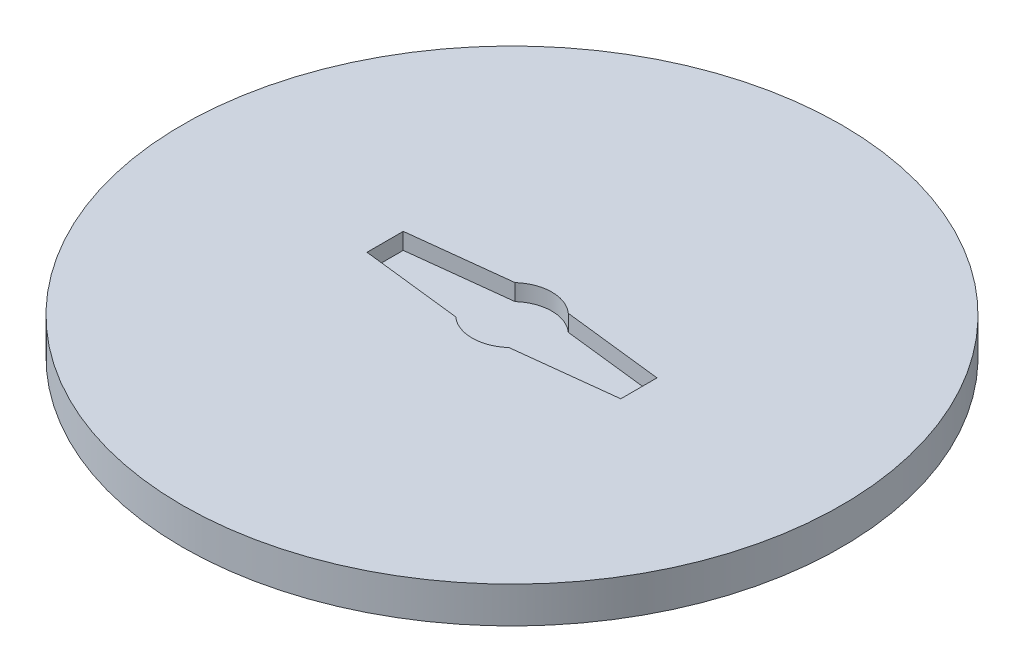
ISO-10303-21;
HEADER;
FILE_DESCRIPTION(('STEP AP214'),'2;1');
FILE_NAME('part.step','',(''),(''),'','','');
FILE_SCHEMA(('AUTOMOTIVE_DESIGN { 1 0 10303 214 1 1 1 1 }'));
ENDSEC;
DATA;
#1=APPLICATION_CONTEXT('core data for automotive mechanical design processes');
#2=APPLICATION_PROTOCOL_DEFINITION('international standard','automotive_design',2000,#1);
#3=PRODUCT_CONTEXT('',#1,'mechanical');
#4=PRODUCT('Part','Part','',(#3));
#5=PRODUCT_RELATED_PRODUCT_CATEGORY('part','',(#4));
#6=PRODUCT_DEFINITION_FORMATION('','',#4);
#7=PRODUCT_DEFINITION_CONTEXT('part definition',#1,'design');
#8=PRODUCT_DEFINITION('design','',#6,#7);
#9=PRODUCT_DEFINITION_SHAPE('','',#8);
#10=(LENGTH_UNIT() NAMED_UNIT(*) SI_UNIT(.MILLI.,.METRE.));
#11=(NAMED_UNIT(*) PLANE_ANGLE_UNIT() SI_UNIT($,.RADIAN.));
#12=(NAMED_UNIT(*) SI_UNIT($,.STERADIAN.) SOLID_ANGLE_UNIT());
#13=UNCERTAINTY_MEASURE_WITH_UNIT(LENGTH_MEASURE(1.E-05),#10,'distance_accuracy_value','');
#14=(GEOMETRIC_REPRESENTATION_CONTEXT(3) GLOBAL_UNCERTAINTY_ASSIGNED_CONTEXT((#13)) GLOBAL_UNIT_ASSIGNED_CONTEXT((#10,
#11,#12)) REPRESENTATION_CONTEXT('',''));
#15=CARTESIAN_POINT('',(0.,0.,0.));
#16=DIRECTION('',(0.,0.,1.));
#17=DIRECTION('',(1.,0.,0.));
#18=AXIS2_PLACEMENT_3D('',#15,#16,#17);
#19=CARTESIAN_POINT('',(0.,5.5,0.));
#20=DIRECTION('',(0.,-1.,0.));
#21=DIRECTION('',(0.,0.,-1.));
#22=AXIS2_PLACEMENT_3D('',#19,#20,#21);
#23=CYLINDRICAL_SURFACE('',#22,50.);
#24=CARTESIAN_POINT('',(0.,5.5,0.));
#25=DIRECTION('',(0.,1.,0.));
#26=DIRECTION('',(0.,0.,1.));
#27=AXIS2_PLACEMENT_3D('',#24,#25,#26);
#28=CIRCLE('',#27,50.);
#29=CARTESIAN_POINT('',(0.,5.5,50.));
#30=VERTEX_POINT('',#29);
#31=EDGE_CURVE('E11',#30,#30,#28,.T.);
#32=ORIENTED_EDGE('',*,*,#31,.F.);
#33=EDGE_LOOP('',(#32));
#34=FACE_BOUND('',#33,.T.);
#35=CARTESIAN_POINT('',(0.,0.,0.));
#36=DIRECTION('',(0.,1.,0.));
#37=DIRECTION('',(0.,0.,1.));
#38=AXIS2_PLACEMENT_3D('',#35,#36,#37);
#39=CIRCLE('',#38,50.);
#40=CARTESIAN_POINT('',(0.,0.,50.));
#41=VERTEX_POINT('',#40);
#42=EDGE_CURVE('E42',#41,#41,#39,.T.);
#43=ORIENTED_EDGE('',*,*,#42,.T.);
#44=EDGE_LOOP('',(#43));
#45=FACE_BOUND('',#44,.T.);
#46=ADVANCED_FACE('F39',(#34,#45),#23,.T.);
#47=CARTESIAN_POINT('',(0.,5.5,0.));
#48=DIRECTION('',(0.,1.,0.));
#49=DIRECTION('',(0.,0.,1.));
#50=AXIS2_PLACEMENT_3D('',#47,#48,#49);
#51=PLANE('',#50);
#52=CARTESIAN_POINT('',(0.,5.5,0.));
#53=DIRECTION('',(0.,1.,0.));
#54=DIRECTION('',(0.,0.,1.));
#55=AXIS2_PLACEMENT_3D('',#52,#53,#54);
#56=CIRCLE('',#55,6.05);
#57=CARTESIAN_POINT('',(4.04382244911915,5.5,-4.5));
#58=VERTEX_POINT('',#57);
#59=CARTESIAN_POINT('',(-4.04382244911915,5.5,-4.5));
#60=VERTEX_POINT('',#59);
#61=EDGE_CURVE('E53',#58,#60,#56,.T.);
#62=ORIENTED_EDGE('',*,*,#61,.F.);
#63=DIRECTION('',(-0.993442807362027,0.,-0.114330173185623));
#64=VECTOR('',#63,1.);
#65=CARTESIAN_POINT('',(19.25,5.5,-2.75));
#66=LINE('',#65,#64);
#67=CARTESIAN_POINT('',(19.25,5.5,-2.75));
#68=VERTEX_POINT('',#67);
#69=EDGE_CURVE('E154',#68,#58,#66,.T.);
#70=ORIENTED_EDGE('',*,*,#69,.F.);
#71=DIRECTION('',(0.,0.,-1.));
#72=VECTOR('',#71,1.);
#73=CARTESIAN_POINT('',(19.25,5.5,-2.75));
#74=LINE('',#73,#72);
#75=CARTESIAN_POINT('',(19.25,5.5,2.75));
#76=VERTEX_POINT('',#75);
#77=EDGE_CURVE('E152',#76,#68,#74,.T.);
#78=ORIENTED_EDGE('',*,*,#77,.F.);
#79=DIRECTION('',(0.993442807362027,0.,-0.114330173185623));
#80=VECTOR('',#79,1.);
#81=CARTESIAN_POINT('',(19.25,5.5,2.75));
#82=LINE('',#81,#80);
#83=CARTESIAN_POINT('',(4.04382244911915,5.5,4.5));
#84=VERTEX_POINT('',#83);
#85=EDGE_CURVE('E113',#84,#76,#82,.T.);
#86=ORIENTED_EDGE('',*,*,#85,.F.);
#87=CARTESIAN_POINT('',(0.,5.5,0.));
#88=DIRECTION('',(0.,1.,0.));
#89=DIRECTION('',(0.,0.,1.));
#90=AXIS2_PLACEMENT_3D('',#87,#88,#89);
#91=CIRCLE('',#90,6.05);
#92=CARTESIAN_POINT('',(-4.04382244911915,5.5,4.5));
#93=VERTEX_POINT('',#92);
#94=EDGE_CURVE('E148',#93,#84,#91,.T.);
#95=ORIENTED_EDGE('',*,*,#94,.F.);
#96=DIRECTION('',(0.993442807362027,0.,0.114330173185623));
#97=VECTOR('',#96,1.);
#98=CARTESIAN_POINT('',(-4.04382244911915,5.5,4.5));
#99=LINE('',#98,#97);
#100=CARTESIAN_POINT('',(-19.25,5.5,2.75));
#101=VERTEX_POINT('',#100);
#102=EDGE_CURVE('E145',#101,#93,#99,.T.);
#103=ORIENTED_EDGE('',*,*,#102,.F.);
#104=DIRECTION('',(0.,0.,1.));
#105=VECTOR('',#104,1.);
#106=CARTESIAN_POINT('',(-19.25,5.5,2.75));
#107=LINE('',#106,#105);
#108=CARTESIAN_POINT('',(-19.25,5.5,-2.75));
#109=VERTEX_POINT('',#108);
#110=EDGE_CURVE('E142',#109,#101,#107,.T.);
#111=ORIENTED_EDGE('',*,*,#110,.F.);
#112=DIRECTION('',(-0.993442807362027,0.,0.114330173185624));
#113=VECTOR('',#112,1.);
#114=CARTESIAN_POINT('',(-4.04382244911915,5.5,-4.5));
#115=LINE('',#114,#113);
#116=EDGE_CURVE('E139',#60,#109,#115,.T.);
#117=ORIENTED_EDGE('',*,*,#116,.F.);
#118=EDGE_LOOP('',(#62,#70,#78,#86,#95,#103,#111,#117));
#119=FACE_BOUND('',#118,.T.);
#120=ORIENTED_EDGE('',*,*,#31,.T.);
#121=EDGE_LOOP('',(#120));
#122=FACE_BOUND('',#121,.T.);
#123=ADVANCED_FACE('F173',(#119,#122),#51,.T.);
#124=CARTESIAN_POINT('',(0.,0.,0.));
#125=DIRECTION('',(0.,1.,0.));
#126=DIRECTION('',(0.,0.,1.));
#127=AXIS2_PLACEMENT_3D('',#124,#125,#126);
#128=PLANE('',#127);
#129=ORIENTED_EDGE('',*,*,#42,.F.);
#130=EDGE_LOOP('',(#129));
#131=FACE_BOUND('',#130,.T.);
#132=ADVANCED_FACE('F200',(#131),#128,.F.);
#133=CARTESIAN_POINT('',(0.,3.,0.));
#134=DIRECTION('',(0.,1.,0.));
#135=DIRECTION('',(0.,0.,1.));
#136=AXIS2_PLACEMENT_3D('',#133,#134,#135);
#137=CYLINDRICAL_SURFACE('',#136,6.05);
#138=ORIENTED_EDGE('',*,*,#61,.T.);
#139=DIRECTION('',(0.,1.,0.));
#140=VECTOR('',#139,1.);
#141=CARTESIAN_POINT('',(-4.04382244911915,3.,-4.5));
#142=LINE('',#141,#140);
#143=CARTESIAN_POINT('',(-4.04382244911915,3.,-4.5));
#144=VERTEX_POINT('',#143);
#145=EDGE_CURVE('E89',#144,#60,#142,.T.);
#146=ORIENTED_EDGE('',*,*,#145,.F.);
#147=CARTESIAN_POINT('',(0.,3.,0.));
#148=DIRECTION('',(0.,1.,0.));
#149=DIRECTION('',(0.,0.,1.));
#150=AXIS2_PLACEMENT_3D('',#147,#148,#149);
#151=CIRCLE('',#150,6.05);
#152=CARTESIAN_POINT('',(4.04382244911915,3.,-4.5));
#153=VERTEX_POINT('',#152);
#154=EDGE_CURVE('E156',#153,#144,#151,.T.);
#155=ORIENTED_EDGE('',*,*,#154,.F.);
#156=DIRECTION('',(0.,1.,0.));
#157=VECTOR('',#156,1.);
#158=CARTESIAN_POINT('',(4.04382244911915,3.,-4.5));
#159=LINE('',#158,#157);
#160=EDGE_CURVE('E61',#153,#58,#159,.T.);
#161=ORIENTED_EDGE('',*,*,#160,.T.);
#162=EDGE_LOOP('',(#138,#146,#155,#161));
#163=FACE_BOUND('',#162,.T.);
#164=ADVANCED_FACE('F193',(#163),#137,.F.);
#165=CARTESIAN_POINT('',(19.25,3.,-2.75));
#166=DIRECTION('',(0.114330173185623,0.,-0.993442807362027));
#167=DIRECTION('',(-0.993442807362027,0.,-0.114330173185623));
#168=AXIS2_PLACEMENT_3D('',#165,#166,#167);
#169=PLANE('',#168);
#170=ORIENTED_EDGE('',*,*,#69,.T.);
#171=ORIENTED_EDGE('',*,*,#160,.F.);
#172=DIRECTION('',(-0.993442807362027,0.,-0.114330173185623));
#173=VECTOR('',#172,1.);
#174=CARTESIAN_POINT('',(19.25,3.,-2.75));
#175=LINE('',#174,#173);
#176=CARTESIAN_POINT('',(19.25,3.,-2.75));
#177=VERTEX_POINT('',#176);
#178=EDGE_CURVE('E125',#177,#153,#175,.T.);
#179=ORIENTED_EDGE('',*,*,#178,.F.);
#180=DIRECTION('',(0.,1.,0.));
#181=VECTOR('',#180,1.);
#182=CARTESIAN_POINT('',(19.25,3.,-2.75));
#183=LINE('',#182,#181);
#184=EDGE_CURVE('E117',#177,#68,#183,.T.);
#185=ORIENTED_EDGE('',*,*,#184,.T.);
#186=EDGE_LOOP('',(#170,#171,#179,#185));
#187=FACE_BOUND('',#186,.T.);
#188=ADVANCED_FACE('F191',(#187),#169,.F.);
#189=CARTESIAN_POINT('',(19.25,3.,-2.75));
#190=DIRECTION('',(1.,0.,0.));
#191=DIRECTION('',(0.,0.,-1.));
#192=AXIS2_PLACEMENT_3D('',#189,#190,#191);
#193=PLANE('',#192);
#194=ORIENTED_EDGE('',*,*,#77,.T.);
#195=ORIENTED_EDGE('',*,*,#184,.F.);
#196=DIRECTION('',(0.,0.,-1.));
#197=VECTOR('',#196,1.);
#198=CARTESIAN_POINT('',(19.25,3.,-2.75));
#199=LINE('',#198,#197);
#200=CARTESIAN_POINT('',(19.25,3.,2.75));
#201=VERTEX_POINT('',#200);
#202=EDGE_CURVE('E121',#201,#177,#199,.T.);
#203=ORIENTED_EDGE('',*,*,#202,.F.);
#204=DIRECTION('',(0.,1.,0.));
#205=VECTOR('',#204,1.);
#206=CARTESIAN_POINT('',(19.25,3.,2.75));
#207=LINE('',#206,#205);
#208=EDGE_CURVE('E106',#201,#76,#207,.T.);
#209=ORIENTED_EDGE('',*,*,#208,.T.);
#210=EDGE_LOOP('',(#194,#195,#203,#209));
#211=FACE_BOUND('',#210,.T.);
#212=ADVANCED_FACE('F122',(#211),#193,.F.);
#213=CARTESIAN_POINT('',(19.25,3.,2.75));
#214=DIRECTION('',(0.114330173185623,0.,0.993442807362027));
#215=DIRECTION('',(0.993442807362027,0.,-0.114330173185624));
#216=AXIS2_PLACEMENT_3D('',#213,#214,#215);
#217=PLANE('',#216);
#218=ORIENTED_EDGE('',*,*,#85,.T.);
#219=ORIENTED_EDGE('',*,*,#208,.F.);
#220=DIRECTION('',(0.993442807362027,0.,-0.114330173185623));
#221=VECTOR('',#220,1.);
#222=CARTESIAN_POINT('',(19.25,3.,2.75));
#223=LINE('',#222,#221);
#224=CARTESIAN_POINT('',(4.04382244911915,3.,4.5));
#225=VERTEX_POINT('',#224);
#226=EDGE_CURVE('E110',#225,#201,#223,.T.);
#227=ORIENTED_EDGE('',*,*,#226,.F.);
#228=DIRECTION('',(0.,1.,0.));
#229=VECTOR('',#228,1.);
#230=CARTESIAN_POINT('',(4.04382244911915,3.,4.5));
#231=LINE('',#230,#229);
#232=EDGE_CURVE('E118',#225,#84,#231,.T.);
#233=ORIENTED_EDGE('',*,*,#232,.T.);
#234=EDGE_LOOP('',(#218,#219,#227,#233));
#235=FACE_BOUND('',#234,.T.);
#236=ADVANCED_FACE('F108',(#235),#217,.F.);
#237=CARTESIAN_POINT('',(0.,3.,0.));
#238=DIRECTION('',(0.,1.,0.));
#239=DIRECTION('',(0.,0.,1.));
#240=AXIS2_PLACEMENT_3D('',#237,#238,#239);
#241=CYLINDRICAL_SURFACE('',#240,6.05);
#242=ORIENTED_EDGE('',*,*,#94,.T.);
#243=ORIENTED_EDGE('',*,*,#232,.F.);
#244=CARTESIAN_POINT('',(0.,3.,0.));
#245=DIRECTION('',(0.,1.,0.));
#246=DIRECTION('',(0.,0.,1.));
#247=AXIS2_PLACEMENT_3D('',#244,#245,#246);
#248=CIRCLE('',#247,6.05);
#249=CARTESIAN_POINT('',(-4.04382244911915,3.,4.5));
#250=VERTEX_POINT('',#249);
#251=EDGE_CURVE('E131',#250,#225,#248,.T.);
#252=ORIENTED_EDGE('',*,*,#251,.F.);
#253=DIRECTION('',(0.,1.,0.));
#254=VECTOR('',#253,1.);
#255=CARTESIAN_POINT('',(-4.04382244911915,3.,4.5));
#256=LINE('',#255,#254);
#257=EDGE_CURVE('E160',#250,#93,#256,.T.);
#258=ORIENTED_EDGE('',*,*,#257,.T.);
#259=EDGE_LOOP('',(#242,#243,#252,#258));
#260=FACE_BOUND('',#259,.T.);
#261=ADVANCED_FACE('F190',(#260),#241,.F.);
#262=CARTESIAN_POINT('',(-4.04382244911915,3.,4.5));
#263=DIRECTION('',(-0.114330173185623,0.,0.993442807362027));
#264=DIRECTION('',(0.993442807362027,0.,0.114330173185623));
#265=AXIS2_PLACEMENT_3D('',#262,#263,#264);
#266=PLANE('',#265);
#267=ORIENTED_EDGE('',*,*,#102,.T.);
#268=ORIENTED_EDGE('',*,*,#257,.F.);
#269=DIRECTION('',(0.993442807362027,0.,0.114330173185623));
#270=VECTOR('',#269,1.);
#271=CARTESIAN_POINT('',(-4.04382244911915,3.,4.5));
#272=LINE('',#271,#270);
#273=CARTESIAN_POINT('',(-19.25,3.,2.75));
#274=VERTEX_POINT('',#273);
#275=EDGE_CURVE('E133',#274,#250,#272,.T.);
#276=ORIENTED_EDGE('',*,*,#275,.F.);
#277=DIRECTION('',(0.,1.,0.));
#278=VECTOR('',#277,1.);
#279=CARTESIAN_POINT('',(-19.25,3.,2.75));
#280=LINE('',#279,#278);
#281=EDGE_CURVE('E162',#274,#101,#280,.T.);
#282=ORIENTED_EDGE('',*,*,#281,.T.);
#283=EDGE_LOOP('',(#267,#268,#276,#282));
#284=FACE_BOUND('',#283,.T.);
#285=ADVANCED_FACE('F188',(#284),#266,.F.);
#286=CARTESIAN_POINT('',(-19.25,3.,2.75));
#287=DIRECTION('',(-1.,0.,0.));
#288=DIRECTION('',(0.,0.,1.));
#289=AXIS2_PLACEMENT_3D('',#286,#287,#288);
#290=PLANE('',#289);
#291=ORIENTED_EDGE('',*,*,#110,.T.);
#292=ORIENTED_EDGE('',*,*,#281,.F.);
#293=DIRECTION('',(0.,0.,1.));
#294=VECTOR('',#293,1.);
#295=CARTESIAN_POINT('',(-19.25,3.,2.75));
#296=LINE('',#295,#294);
#297=CARTESIAN_POINT('',(-19.25,3.,-2.75));
#298=VERTEX_POINT('',#297);
#299=EDGE_CURVE('E183',#298,#274,#296,.T.);
#300=ORIENTED_EDGE('',*,*,#299,.F.);
#301=DIRECTION('',(0.,1.,0.));
#302=VECTOR('',#301,1.);
#303=CARTESIAN_POINT('',(-19.25,3.,-2.75));
#304=LINE('',#303,#302);
#305=EDGE_CURVE('E164',#298,#109,#304,.T.);
#306=ORIENTED_EDGE('',*,*,#305,.T.);
#307=EDGE_LOOP('',(#291,#292,#300,#306));
#308=FACE_BOUND('',#307,.T.);
#309=ADVANCED_FACE('F179',(#308),#290,.F.);
#310=CARTESIAN_POINT('',(-4.04382244911915,3.,-4.5));
#311=DIRECTION('',(-0.114330173185624,0.,-0.993442807362027));
#312=DIRECTION('',(-0.993442807362027,0.,0.114330173185624));
#313=AXIS2_PLACEMENT_3D('',#310,#311,#312);
#314=PLANE('',#313);
#315=ORIENTED_EDGE('',*,*,#116,.T.);
#316=ORIENTED_EDGE('',*,*,#305,.F.);
#317=DIRECTION('',(-0.993442807362027,0.,0.114330173185624));
#318=VECTOR('',#317,1.);
#319=CARTESIAN_POINT('',(-4.04382244911915,3.,-4.5));
#320=LINE('',#319,#318);
#321=EDGE_CURVE('E171',#144,#298,#320,.T.);
#322=ORIENTED_EDGE('',*,*,#321,.F.);
#323=ORIENTED_EDGE('',*,*,#145,.T.);
#324=EDGE_LOOP('',(#315,#316,#322,#323));
#325=FACE_BOUND('',#324,.T.);
#326=ADVANCED_FACE('F168',(#325),#314,.F.);
#327=CARTESIAN_POINT('',(0.,3.,0.));
#328=DIRECTION('',(0.,1.,0.));
#329=DIRECTION('',(0.,0.,1.));
#330=AXIS2_PLACEMENT_3D('',#327,#328,#329);
#331=PLANE('',#330);
#332=ORIENTED_EDGE('',*,*,#154,.T.);
#333=ORIENTED_EDGE('',*,*,#321,.T.);
#334=ORIENTED_EDGE('',*,*,#299,.T.);
#335=ORIENTED_EDGE('',*,*,#275,.T.);
#336=ORIENTED_EDGE('',*,*,#251,.T.);
#337=ORIENTED_EDGE('',*,*,#226,.T.);
#338=ORIENTED_EDGE('',*,*,#202,.T.);
#339=ORIENTED_EDGE('',*,*,#178,.T.);
#340=EDGE_LOOP('',(#332,#333,#334,#335,#336,#337,#338,#339));
#341=FACE_BOUND('',#340,.T.);
#342=ADVANCED_FACE('F128',(#341),#331,.T.);
#343=CLOSED_SHELL('',(#46,#123,#132,#164,#188,#212,#236,#261,#285,#309,#326,#342));
#344=MANIFOLD_SOLID_BREP('B2',#343);
#345=ADVANCED_BREP_SHAPE_REPRESENTATION('',(#18,#344),#14);
#346=SHAPE_DEFINITION_REPRESENTATION(#9,#345);
ENDSEC;
END-ISO-10303-21;
